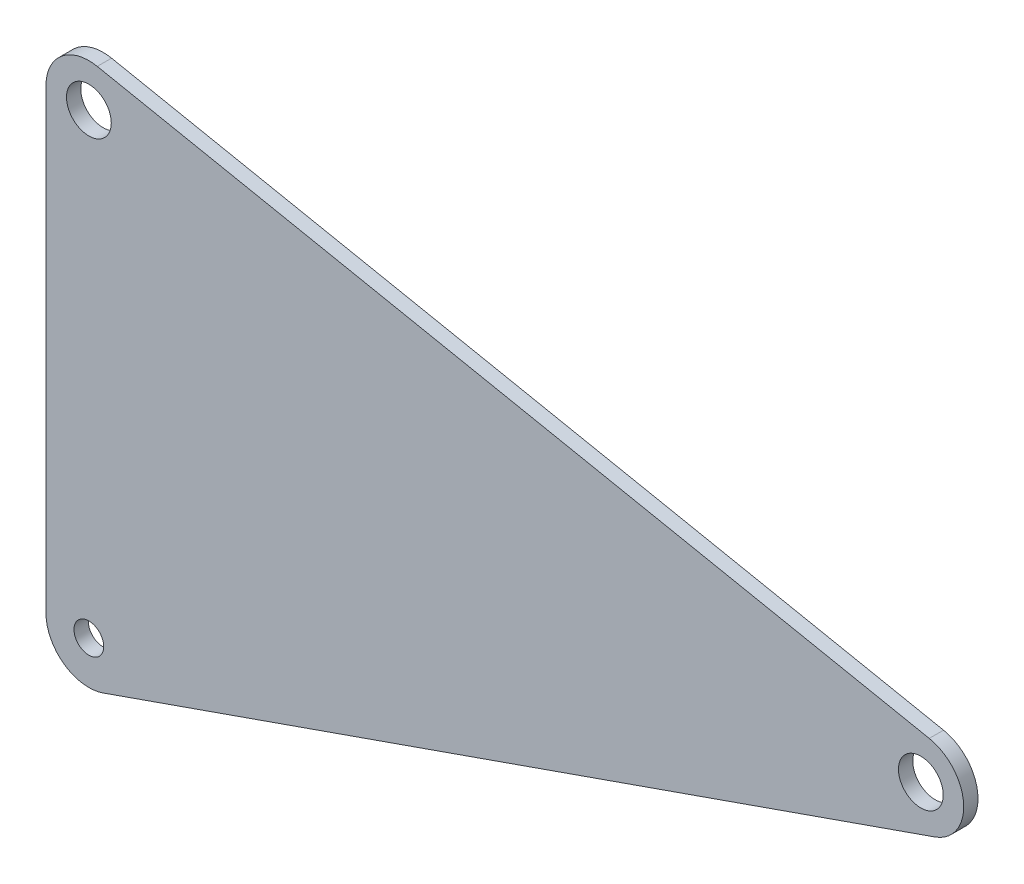
ISO-10303-21;
HEADER;
FILE_DESCRIPTION(('STEP AP214'),'2;1');
FILE_NAME('part.step','',(''),(''),'','','');
FILE_SCHEMA(('AUTOMOTIVE_DESIGN { 1 0 10303 214 1 1 1 1 }'));
ENDSEC;
DATA;
#1=APPLICATION_CONTEXT('core data for automotive mechanical design processes');
#2=APPLICATION_PROTOCOL_DEFINITION('international standard','automotive_design',2000,#1);
#3=PRODUCT_CONTEXT('',#1,'mechanical');
#4=PRODUCT('Part','Part','',(#3));
#5=PRODUCT_RELATED_PRODUCT_CATEGORY('part','',(#4));
#6=PRODUCT_DEFINITION_FORMATION('','',#4);
#7=PRODUCT_DEFINITION_CONTEXT('part definition',#1,'design');
#8=PRODUCT_DEFINITION('design','',#6,#7);
#9=PRODUCT_DEFINITION_SHAPE('','',#8);
#10=(LENGTH_UNIT() NAMED_UNIT(*) SI_UNIT(.MILLI.,.METRE.));
#11=(NAMED_UNIT(*) PLANE_ANGLE_UNIT() SI_UNIT($,.RADIAN.));
#12=(NAMED_UNIT(*) SI_UNIT($,.STERADIAN.) SOLID_ANGLE_UNIT());
#13=UNCERTAINTY_MEASURE_WITH_UNIT(LENGTH_MEASURE(1.E-05),#10,'distance_accuracy_value','');
#14=(GEOMETRIC_REPRESENTATION_CONTEXT(3) GLOBAL_UNCERTAINTY_ASSIGNED_CONTEXT((#13)) GLOBAL_UNIT_ASSIGNED_CONTEXT((#10,
#11,#12)) REPRESENTATION_CONTEXT('',''));
#15=CARTESIAN_POINT('',(0.,0.,0.));
#16=DIRECTION('',(0.,0.,1.));
#17=DIRECTION('',(1.,0.,0.));
#18=AXIS2_PLACEMENT_3D('',#15,#16,#17);
#19=CARTESIAN_POINT('',(115.57,270.969996193646,-1.5875));
#20=DIRECTION('',(0.,0.,1.));
#21=DIRECTION('',(1.,0.,0.));
#22=AXIS2_PLACEMENT_3D('',#19,#20,#21);
#23=CYLINDRICAL_SURFACE('',#22,4.76249999999996);
#24=CARTESIAN_POINT('',(115.57,270.969996193646,0.));
#25=DIRECTION('',(0.,0.,1.));
#26=DIRECTION('',(1.,0.,0.));
#27=AXIS2_PLACEMENT_3D('',#24,#25,#26);
#28=CIRCLE('',#27,4.76249999999996);
#29=CARTESIAN_POINT('',(116.501801421548,275.640451456337,0.));
#30=VERTEX_POINT('',#29);
#31=CARTESIAN_POINT('',(110.8075,270.969996193646,0.));
#32=VERTEX_POINT('',#31);
#33=EDGE_CURVE('E122',#30,#32,#28,.T.);
#34=ORIENTED_EDGE('',*,*,#33,.F.);
#35=DIRECTION('',(0.,0.,1.));
#36=VECTOR('',#35,1.);
#37=CARTESIAN_POINT('',(116.501801421548,275.640451456337,-1.5875));
#38=LINE('',#37,#36);
#39=CARTESIAN_POINT('',(116.501801421548,275.640451456337,-1.5875));
#40=VERTEX_POINT('',#39);
#41=EDGE_CURVE('E11',#40,#30,#38,.T.);
#42=ORIENTED_EDGE('',*,*,#41,.F.);
#43=CARTESIAN_POINT('',(115.57,270.969996193646,-1.5875));
#44=DIRECTION('',(0.,0.,1.));
#45=DIRECTION('',(1.,0.,0.));
#46=AXIS2_PLACEMENT_3D('',#43,#44,#45);
#47=CIRCLE('',#46,4.76249999999996);
#48=CARTESIAN_POINT('',(110.8075,270.969996193646,-1.5875));
#49=VERTEX_POINT('',#48);
#50=EDGE_CURVE('E137',#40,#49,#47,.T.);
#51=ORIENTED_EDGE('',*,*,#50,.T.);
#52=DIRECTION('',(0.,0.,1.));
#53=VECTOR('',#52,1.);
#54=CARTESIAN_POINT('',(110.8075,270.969996193646,-1.5875));
#55=LINE('',#54,#53);
#56=EDGE_CURVE('E40',#49,#32,#55,.T.);
#57=ORIENTED_EDGE('',*,*,#56,.T.);
#58=EDGE_LOOP('',(#34,#42,#51,#57));
#59=FACE_BOUND('',#58,.T.);
#60=ADVANCED_FACE('F37',(#59),#23,.T.);
#61=CARTESIAN_POINT('',(116.501801421548,275.640451456337,-1.5875));
#62=DIRECTION('',(0.195653841794947,0.980673021037531,0.));
#63=DIRECTION('',(-0.980673021037531,0.195653841794947,0.));
#64=AXIS2_PLACEMENT_3D('',#61,#62,#63);
#65=PLANE('',#64);
#66=DIRECTION('',(-0.980673021037531,0.195653841794947,0.));
#67=VECTOR('',#66,1.);
#68=CARTESIAN_POINT('',(116.501801421548,275.640451456337,0.));
#69=LINE('',#68,#67);
#70=CARTESIAN_POINT('',(208.933971344496,257.199331161486,0.));
#71=VERTEX_POINT('',#70);
#72=EDGE_CURVE('E135',#71,#30,#69,.T.);
#73=ORIENTED_EDGE('',*,*,#72,.F.);
#74=DIRECTION('',(0.,0.,1.));
#75=VECTOR('',#74,1.);
#76=CARTESIAN_POINT('',(208.933971344496,257.199331161486,-1.5875));
#77=LINE('',#76,#75);
#78=CARTESIAN_POINT('',(208.933971344496,257.199331161486,-1.5875));
#79=VERTEX_POINT('',#78);
#80=EDGE_CURVE('E46',#79,#71,#77,.T.);
#81=ORIENTED_EDGE('',*,*,#80,.F.);
#82=DIRECTION('',(-0.980673021037531,0.195653841794947,0.));
#83=VECTOR('',#82,1.);
#84=CARTESIAN_POINT('',(116.501801421548,275.640451456337,-1.5875));
#85=LINE('',#84,#83);
#86=EDGE_CURVE('E112',#79,#40,#85,.T.);
#87=ORIENTED_EDGE('',*,*,#86,.T.);
#88=ORIENTED_EDGE('',*,*,#41,.T.);
#89=EDGE_LOOP('',(#73,#81,#87,#88));
#90=FACE_BOUND('',#89,.T.);
#91=ADVANCED_FACE('F145',(#90),#65,.T.);
#92=CARTESIAN_POINT('',(208.002169922948,252.528875898795,-1.5875));
#93=DIRECTION('',(0.,0.,1.));
#94=DIRECTION('',(1.,0.,0.));
#95=AXIS2_PLACEMENT_3D('',#92,#93,#94);
#96=CYLINDRICAL_SURFACE('',#95,4.76249999999996);
#97=CARTESIAN_POINT('',(208.002169922948,252.528875898795,0.));
#98=DIRECTION('',(0.,0.,1.));
#99=DIRECTION('',(1.,0.,0.));
#100=AXIS2_PLACEMENT_3D('',#97,#98,#99);
#101=CIRCLE('',#100,4.76249999999996);
#102=CARTESIAN_POINT('',(209.575793949786,248.033866035384,0.));
#103=VERTEX_POINT('',#102);
#104=EDGE_CURVE('E99',#103,#71,#101,.T.);
#105=ORIENTED_EDGE('',*,*,#104,.F.);
#106=DIRECTION('',(0.,0.,1.));
#107=VECTOR('',#106,1.);
#108=CARTESIAN_POINT('',(209.575793949786,248.033866035384,-1.5875));
#109=LINE('',#108,#107);
#110=CARTESIAN_POINT('',(209.575793949786,248.033866035384,-1.5875));
#111=VERTEX_POINT('',#110);
#112=EDGE_CURVE('E94',#111,#103,#109,.T.);
#113=ORIENTED_EDGE('',*,*,#112,.F.);
#114=CARTESIAN_POINT('',(208.002169922948,252.528875898795,-1.5875));
#115=DIRECTION('',(0.,0.,1.));
#116=DIRECTION('',(1.,0.,0.));
#117=AXIS2_PLACEMENT_3D('',#114,#115,#116);
#118=CIRCLE('',#117,4.76249999999996);
#119=EDGE_CURVE('E97',#111,#79,#118,.T.);
#120=ORIENTED_EDGE('',*,*,#119,.T.);
#121=ORIENTED_EDGE('',*,*,#80,.T.);
#122=EDGE_LOOP('',(#105,#113,#120,#121));
#123=FACE_BOUND('',#122,.T.);
#124=ADVANCED_FACE('F96',(#123),#96,.T.);
#125=CARTESIAN_POINT('',(117.143624026838,215.674986330235,-1.5875));
#126=DIRECTION('',(0.330419743168159,-0.943834092054683,0.));
#127=DIRECTION('',(0.943834092054683,0.330419743168159,0.));
#128=AXIS2_PLACEMENT_3D('',#125,#126,#127);
#129=PLANE('',#128);
#130=DIRECTION('',(0.943834092054683,0.330419743168159,0.));
#131=VECTOR('',#130,1.);
#132=CARTESIAN_POINT('',(117.143624026838,215.674986330235,0.));
#133=LINE('',#132,#131);
#134=CARTESIAN_POINT('',(117.143624026838,215.674986330235,0.));
#135=VERTEX_POINT('',#134);
#136=EDGE_CURVE('E132',#135,#103,#133,.T.);
#137=ORIENTED_EDGE('',*,*,#136,.F.);
#138=DIRECTION('',(0.,0.,1.));
#139=VECTOR('',#138,1.);
#140=CARTESIAN_POINT('',(117.143624026838,215.674986330235,-1.5875));
#141=LINE('',#140,#139);
#142=CARTESIAN_POINT('',(117.143624026838,215.674986330235,-1.5875));
#143=VERTEX_POINT('',#142);
#144=EDGE_CURVE('E104',#143,#135,#141,.T.);
#145=ORIENTED_EDGE('',*,*,#144,.F.);
#146=DIRECTION('',(0.943834092054683,0.330419743168159,0.));
#147=VECTOR('',#146,1.);
#148=CARTESIAN_POINT('',(117.143624026838,215.674986330235,-1.5875));
#149=LINE('',#148,#147);
#150=EDGE_CURVE('E110',#143,#111,#149,.T.);
#151=ORIENTED_EDGE('',*,*,#150,.T.);
#152=ORIENTED_EDGE('',*,*,#112,.T.);
#153=EDGE_LOOP('',(#137,#145,#151,#152));
#154=FACE_BOUND('',#153,.T.);
#155=ADVANCED_FACE('F114',(#154),#129,.T.);
#156=CARTESIAN_POINT('',(115.57,220.169996193646,-1.5875));
#157=DIRECTION('',(0.,0.,1.));
#158=DIRECTION('',(1.,0.,0.));
#159=AXIS2_PLACEMENT_3D('',#156,#157,#158);
#160=CYLINDRICAL_SURFACE('',#159,4.76250000000002);
#161=CARTESIAN_POINT('',(115.57,220.169996193646,0.));
#162=DIRECTION('',(0.,0.,1.));
#163=DIRECTION('',(1.,0.,0.));
#164=AXIS2_PLACEMENT_3D('',#161,#162,#163);
#165=CIRCLE('',#164,4.76250000000002);
#166=CARTESIAN_POINT('',(110.8075,220.169996193646,0.));
#167=VERTEX_POINT('',#166);
#168=EDGE_CURVE('E129',#167,#135,#165,.T.);
#169=ORIENTED_EDGE('',*,*,#168,.F.);
#170=DIRECTION('',(0.,0.,1.));
#171=VECTOR('',#170,1.);
#172=CARTESIAN_POINT('',(110.8075,220.169996193646,-1.5875));
#173=LINE('',#172,#171);
#174=CARTESIAN_POINT('',(110.8075,220.169996193646,-1.5875));
#175=VERTEX_POINT('',#174);
#176=EDGE_CURVE('E140',#175,#167,#173,.T.);
#177=ORIENTED_EDGE('',*,*,#176,.F.);
#178=CARTESIAN_POINT('',(115.57,220.169996193646,-1.5875));
#179=DIRECTION('',(0.,0.,1.));
#180=DIRECTION('',(1.,0.,0.));
#181=AXIS2_PLACEMENT_3D('',#178,#179,#180);
#182=CIRCLE('',#181,4.76250000000002);
#183=EDGE_CURVE('E115',#175,#143,#182,.T.);
#184=ORIENTED_EDGE('',*,*,#183,.T.);
#185=ORIENTED_EDGE('',*,*,#144,.T.);
#186=EDGE_LOOP('',(#169,#177,#184,#185));
#187=FACE_BOUND('',#186,.T.);
#188=ADVANCED_FACE('F158',(#187),#160,.T.);
#189=CARTESIAN_POINT('',(110.8075,270.969996193646,-1.5875));
#190=DIRECTION('',(-1.,0.,0.));
#191=DIRECTION('',(0.,-1.,0.));
#192=AXIS2_PLACEMENT_3D('',#189,#190,#191);
#193=PLANE('',#192);
#194=DIRECTION('',(0.,-1.,0.));
#195=VECTOR('',#194,1.);
#196=CARTESIAN_POINT('',(110.8075,270.969996193646,0.));
#197=LINE('',#196,#195);
#198=EDGE_CURVE('E125',#32,#167,#197,.T.);
#199=ORIENTED_EDGE('',*,*,#198,.F.);
#200=ORIENTED_EDGE('',*,*,#56,.F.);
#201=DIRECTION('',(0.,-1.,0.));
#202=VECTOR('',#201,1.);
#203=CARTESIAN_POINT('',(110.8075,270.969996193646,-1.5875));
#204=LINE('',#203,#202);
#205=EDGE_CURVE('E117',#49,#175,#204,.T.);
#206=ORIENTED_EDGE('',*,*,#205,.T.);
#207=ORIENTED_EDGE('',*,*,#176,.T.);
#208=EDGE_LOOP('',(#199,#200,#206,#207));
#209=FACE_BOUND('',#208,.T.);
#210=ADVANCED_FACE('F142',(#209),#193,.T.);
#211=CARTESIAN_POINT('',(115.57,270.969996193646,-1.5875));
#212=DIRECTION('',(0.,0.,1.));
#213=DIRECTION('',(1.,0.,0.));
#214=AXIS2_PLACEMENT_3D('',#211,#212,#213);
#215=PLANE('',#214);
#216=CARTESIAN_POINT('',(115.57,220.169996193646,-1.5875));
#217=DIRECTION('',(0.,0.,1.));
#218=DIRECTION('',(1.,0.,0.));
#219=AXIS2_PLACEMENT_3D('',#216,#217,#218);
#220=CIRCLE('',#219,1.65100000000001);
#221=CARTESIAN_POINT('',(117.221,220.169996193646,-1.5875));
#222=VERTEX_POINT('',#221);
#223=EDGE_CURVE('E188',#222,#222,#220,.T.);
#224=ORIENTED_EDGE('',*,*,#223,.T.);
#225=EDGE_LOOP('',(#224));
#226=FACE_BOUND('',#225,.T.);
#227=CARTESIAN_POINT('',(208.002169922948,252.528875898795,-1.5875));
#228=DIRECTION('',(0.,0.,1.));
#229=DIRECTION('',(1.,0.,0.));
#230=AXIS2_PLACEMENT_3D('',#227,#228,#229);
#231=CIRCLE('',#230,2.48920000000001);
#232=CARTESIAN_POINT('',(210.491369922948,252.528875898795,-1.5875));
#233=VERTEX_POINT('',#232);
#234=EDGE_CURVE('E196',#233,#233,#231,.T.);
#235=ORIENTED_EDGE('',*,*,#234,.T.);
#236=EDGE_LOOP('',(#235));
#237=FACE_BOUND('',#236,.T.);
#238=CARTESIAN_POINT('',(115.57,270.969996193646,-1.5875));
#239=DIRECTION('',(0.,0.,1.));
#240=DIRECTION('',(1.,0.,0.));
#241=AXIS2_PLACEMENT_3D('',#238,#239,#240);
#242=CIRCLE('',#241,2.48920000000001);
#243=CARTESIAN_POINT('',(118.0592,270.969996193646,-1.5875));
#244=VERTEX_POINT('',#243);
#245=EDGE_CURVE('E126',#244,#244,#242,.T.);
#246=ORIENTED_EDGE('',*,*,#245,.T.);
#247=EDGE_LOOP('',(#246));
#248=FACE_BOUND('',#247,.T.);
#249=ORIENTED_EDGE('',*,*,#50,.F.);
#250=ORIENTED_EDGE('',*,*,#86,.F.);
#251=ORIENTED_EDGE('',*,*,#119,.F.);
#252=ORIENTED_EDGE('',*,*,#150,.F.);
#253=ORIENTED_EDGE('',*,*,#183,.F.);
#254=ORIENTED_EDGE('',*,*,#205,.F.);
#255=EDGE_LOOP('',(#249,#250,#251,#252,#253,#254));
#256=FACE_BOUND('',#255,.T.);
#257=ADVANCED_FACE('F108',(#226,#237,#248,#256),#215,.F.);
#258=CARTESIAN_POINT('',(115.57,270.969996193646,0.));
#259=DIRECTION('',(0.,0.,1.));
#260=DIRECTION('',(1.,0.,0.));
#261=AXIS2_PLACEMENT_3D('',#258,#259,#260);
#262=PLANE('',#261);
#263=CARTESIAN_POINT('',(115.57,220.169996193646,0.));
#264=DIRECTION('',(0.,0.,1.));
#265=DIRECTION('',(1.,0.,0.));
#266=AXIS2_PLACEMENT_3D('',#263,#264,#265);
#267=CIRCLE('',#266,1.65100000000001);
#268=CARTESIAN_POINT('',(117.221,220.169996193646,0.));
#269=VERTEX_POINT('',#268);
#270=EDGE_CURVE('E191',#269,#269,#267,.T.);
#271=ORIENTED_EDGE('',*,*,#270,.F.);
#272=EDGE_LOOP('',(#271));
#273=FACE_BOUND('',#272,.T.);
#274=CARTESIAN_POINT('',(208.002169922948,252.528875898795,0.));
#275=DIRECTION('',(0.,0.,1.));
#276=DIRECTION('',(1.,0.,0.));
#277=AXIS2_PLACEMENT_3D('',#274,#275,#276);
#278=CIRCLE('',#277,2.48920000000001);
#279=CARTESIAN_POINT('',(210.491369922948,252.528875898795,0.));
#280=VERTEX_POINT('',#279);
#281=EDGE_CURVE('E193',#280,#280,#278,.T.);
#282=ORIENTED_EDGE('',*,*,#281,.F.);
#283=EDGE_LOOP('',(#282));
#284=FACE_BOUND('',#283,.T.);
#285=CARTESIAN_POINT('',(115.57,270.969996193646,0.));
#286=DIRECTION('',(0.,0.,1.));
#287=DIRECTION('',(1.,0.,0.));
#288=AXIS2_PLACEMENT_3D('',#285,#286,#287);
#289=CIRCLE('',#288,2.48920000000001);
#290=CARTESIAN_POINT('',(118.0592,270.969996193646,0.));
#291=VERTEX_POINT('',#290);
#292=EDGE_CURVE('E199',#291,#291,#289,.T.);
#293=ORIENTED_EDGE('',*,*,#292,.F.);
#294=EDGE_LOOP('',(#293));
#295=FACE_BOUND('',#294,.T.);
#296=ORIENTED_EDGE('',*,*,#33,.T.);
#297=ORIENTED_EDGE('',*,*,#198,.T.);
#298=ORIENTED_EDGE('',*,*,#168,.T.);
#299=ORIENTED_EDGE('',*,*,#136,.T.);
#300=ORIENTED_EDGE('',*,*,#104,.T.);
#301=ORIENTED_EDGE('',*,*,#72,.T.);
#302=EDGE_LOOP('',(#296,#297,#298,#299,#300,#301));
#303=FACE_BOUND('',#302,.T.);
#304=ADVANCED_FACE('F144',(#273,#284,#295,#303),#262,.T.);
#305=CARTESIAN_POINT('',(115.57,270.969996193646,-1.5875));
#306=DIRECTION('',(0.,0.,1.));
#307=DIRECTION('',(1.,0.,0.));
#308=AXIS2_PLACEMENT_3D('',#305,#306,#307);
#309=CYLINDRICAL_SURFACE('',#308,2.48920000000001);
#310=ORIENTED_EDGE('',*,*,#245,.F.);
#311=EDGE_LOOP('',(#310));
#312=FACE_BOUND('',#311,.T.);
#313=ORIENTED_EDGE('',*,*,#292,.T.);
#314=EDGE_LOOP('',(#313));
#315=FACE_BOUND('',#314,.T.);
#316=ADVANCED_FACE('F169',(#312,#315),#309,.F.);
#317=CARTESIAN_POINT('',(208.002169922948,252.528875898795,-1.5875));
#318=DIRECTION('',(0.,0.,1.));
#319=DIRECTION('',(1.,0.,0.));
#320=AXIS2_PLACEMENT_3D('',#317,#318,#319);
#321=CYLINDRICAL_SURFACE('',#320,2.48920000000001);
#322=ORIENTED_EDGE('',*,*,#234,.F.);
#323=EDGE_LOOP('',(#322));
#324=FACE_BOUND('',#323,.T.);
#325=ORIENTED_EDGE('',*,*,#281,.T.);
#326=EDGE_LOOP('',(#325));
#327=FACE_BOUND('',#326,.T.);
#328=ADVANCED_FACE('F176',(#324,#327),#321,.F.);
#329=CARTESIAN_POINT('',(115.57,220.169996193646,-1.5875));
#330=DIRECTION('',(0.,0.,1.));
#331=DIRECTION('',(1.,0.,0.));
#332=AXIS2_PLACEMENT_3D('',#329,#330,#331);
#333=CYLINDRICAL_SURFACE('',#332,1.65100000000001);
#334=ORIENTED_EDGE('',*,*,#223,.F.);
#335=EDGE_LOOP('',(#334));
#336=FACE_BOUND('',#335,.T.);
#337=ORIENTED_EDGE('',*,*,#270,.T.);
#338=EDGE_LOOP('',(#337));
#339=FACE_BOUND('',#338,.T.);
#340=ADVANCED_FACE('F180',(#336,#339),#333,.F.);
#341=CLOSED_SHELL('',(#60,#91,#124,#155,#188,#210,#257,#304,#316,#328,#340));
#342=MANIFOLD_SOLID_BREP('B2',#341);
#343=ADVANCED_BREP_SHAPE_REPRESENTATION('',(#18,#342),#14);
#344=SHAPE_DEFINITION_REPRESENTATION(#9,#343);
ENDSEC;
END-ISO-10303-21;
